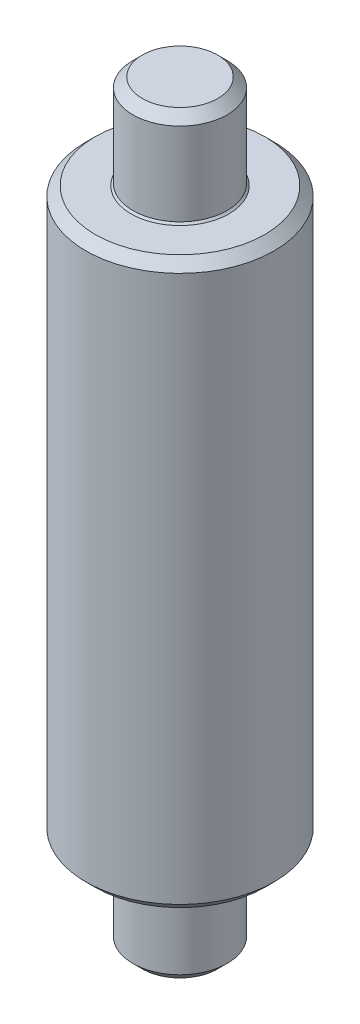
ISO-10303-21;
HEADER;
FILE_DESCRIPTION(('STEP AP214'),'2;1');
FILE_NAME('part.step','',(''),(''),'','','');
FILE_SCHEMA(('AUTOMOTIVE_DESIGN { 1 0 10303 214 1 1 1 1 }'));
ENDSEC;
DATA;
#1=APPLICATION_CONTEXT('core data for automotive mechanical design processes');
#2=APPLICATION_PROTOCOL_DEFINITION('international standard','automotive_design',2000,#1);
#3=PRODUCT_CONTEXT('',#1,'mechanical');
#4=PRODUCT('Part','Part','',(#3));
#5=PRODUCT_RELATED_PRODUCT_CATEGORY('part','',(#4));
#6=PRODUCT_DEFINITION_FORMATION('','',#4);
#7=PRODUCT_DEFINITION_CONTEXT('part definition',#1,'design');
#8=PRODUCT_DEFINITION('design','',#6,#7);
#9=PRODUCT_DEFINITION_SHAPE('','',#8);
#10=(LENGTH_UNIT() NAMED_UNIT(*) SI_UNIT(.MILLI.,.METRE.));
#11=(NAMED_UNIT(*) PLANE_ANGLE_UNIT() SI_UNIT($,.RADIAN.));
#12=(NAMED_UNIT(*) SI_UNIT($,.STERADIAN.) SOLID_ANGLE_UNIT());
#13=UNCERTAINTY_MEASURE_WITH_UNIT(LENGTH_MEASURE(1.E-05),#10,'distance_accuracy_value','');
#14=(GEOMETRIC_REPRESENTATION_CONTEXT(3) GLOBAL_UNCERTAINTY_ASSIGNED_CONTEXT((#13)) GLOBAL_UNIT_ASSIGNED_CONTEXT((#10,
#11,#12)) REPRESENTATION_CONTEXT('',''));
#15=CARTESIAN_POINT('',(0.,0.,0.));
#16=DIRECTION('',(0.,0.,1.));
#17=DIRECTION('',(1.,0.,0.));
#18=AXIS2_PLACEMENT_3D('',#15,#16,#17);
#19=CARTESIAN_POINT('',(0.,40.,0.));
#20=DIRECTION('',(0.,-1.,0.));
#21=DIRECTION('',(1.,0.,0.));
#22=AXIS2_PLACEMENT_3D('',#19,#20,#21);
#23=PLANE('',#22);
#24=CARTESIAN_POINT('',(0.,40.,0.));
#25=DIRECTION('',(0.,-1.,0.));
#26=DIRECTION('',(1.,0.,0.));
#27=AXIS2_PLACEMENT_3D('',#24,#25,#26);
#28=CIRCLE('',#27,3.99999999999999);
#29=CARTESIAN_POINT('',(3.99999999999998,40.,0.));
#30=VERTEX_POINT('',#29);
#31=EDGE_CURVE('E59',#30,#30,#28,.F.);
#32=ORIENTED_EDGE('',*,*,#31,.T.);
#33=EDGE_LOOP('',(#32));
#34=FACE_BOUND('',#33,.T.);
#35=ADVANCED_FACE('F35',(#34),#23,.F.);
#36=CARTESIAN_POINT('',(0.,40.,0.));
#37=DIRECTION('',(0.,1.,0.));
#38=DIRECTION('',(-1.,0.,0.));
#39=AXIS2_PLACEMENT_3D('',#36,#37,#38);
#40=CYLINDRICAL_SURFACE('',#39,5.00000000000001);
#41=CARTESIAN_POINT('',(0.,30.2,0.));
#42=DIRECTION('',(0.,-1.,0.));
#43=DIRECTION('',(1.,0.,0.));
#44=AXIS2_PLACEMENT_3D('',#41,#42,#43);
#45=CIRCLE('',#44,5.00000000000001);
#46=CARTESIAN_POINT('',(5.,30.2,0.));
#47=VERTEX_POINT('',#46);
#48=EDGE_CURVE('E51',#47,#47,#45,.F.);
#49=ORIENTED_EDGE('',*,*,#48,.T.);
#50=EDGE_LOOP('',(#49));
#51=FACE_BOUND('',#50,.T.);
#52=CARTESIAN_POINT('',(0.,39.,0.));
#53=DIRECTION('',(0.,-1.,0.));
#54=DIRECTION('',(1.,0.,0.));
#55=AXIS2_PLACEMENT_3D('',#52,#53,#54);
#56=CIRCLE('',#55,5.00000000000001);
#57=CARTESIAN_POINT('',(5.,39.,0.));
#58=VERTEX_POINT('',#57);
#59=EDGE_CURVE('E56',#58,#58,#56,.T.);
#60=ORIENTED_EDGE('',*,*,#59,.T.);
#61=EDGE_LOOP('',(#60));
#62=FACE_BOUND('',#61,.T.);
#63=ADVANCED_FACE('F93',(#51,#62),#40,.T.);
#64=CARTESIAN_POINT('',(5.00000000000001,30.,0.));
#65=DIRECTION('',(0.,-1.,0.));
#66=DIRECTION('',(1.,0.,0.));
#67=AXIS2_PLACEMENT_3D('',#64,#65,#66);
#68=PLANE('',#67);
#69=CARTESIAN_POINT('',(0.,30.,0.));
#70=DIRECTION('',(0.,-1.,0.));
#71=DIRECTION('',(1.,0.,0.));
#72=AXIS2_PLACEMENT_3D('',#69,#70,#71);
#73=CIRCLE('',#72,5.2);
#74=CARTESIAN_POINT('',(5.19999999999999,30.,0.));
#75=VERTEX_POINT('',#74);
#76=EDGE_CURVE('E47',#75,#75,#73,.T.);
#77=ORIENTED_EDGE('',*,*,#76,.T.);
#78=EDGE_LOOP('',(#77));
#79=FACE_BOUND('',#78,.T.);
#80=CARTESIAN_POINT('',(0.,30.,0.));
#81=DIRECTION('',(0.,-1.,0.));
#82=DIRECTION('',(1.,0.,0.));
#83=AXIS2_PLACEMENT_3D('',#80,#81,#82);
#84=CIRCLE('',#83,9.00000000000003);
#85=CARTESIAN_POINT('',(9.00000000000002,30.,0.));
#86=VERTEX_POINT('',#85);
#87=EDGE_CURVE('E68',#86,#86,#84,.F.);
#88=ORIENTED_EDGE('',*,*,#87,.T.);
#89=EDGE_LOOP('',(#88));
#90=FACE_BOUND('',#89,.T.);
#91=ADVANCED_FACE('F91',(#79,#90),#68,.F.);
#92=CARTESIAN_POINT('',(0.,40.,0.));
#93=DIRECTION('',(0.,1.,0.));
#94=DIRECTION('',(-1.,0.,0.));
#95=AXIS2_PLACEMENT_3D('',#92,#93,#94);
#96=CYLINDRICAL_SURFACE('',#95,10.);
#97=CARTESIAN_POINT('',(0.,-29.,0.));
#98=DIRECTION('',(0.,1.,0.));
#99=DIRECTION('',(-1.,0.,0.));
#100=AXIS2_PLACEMENT_3D('',#97,#98,#99);
#101=CIRCLE('',#100,10.);
#102=CARTESIAN_POINT('',(-10.,-29.,0.));
#103=VERTEX_POINT('',#102);
#104=EDGE_CURVE('E74',#103,#103,#101,.T.);
#105=ORIENTED_EDGE('',*,*,#104,.T.);
#106=EDGE_LOOP('',(#105));
#107=FACE_BOUND('',#106,.T.);
#108=CARTESIAN_POINT('',(0.,29.,0.));
#109=DIRECTION('',(0.,-1.,0.));
#110=DIRECTION('',(1.,0.,0.));
#111=AXIS2_PLACEMENT_3D('',#108,#109,#110);
#112=CIRCLE('',#111,10.);
#113=CARTESIAN_POINT('',(10.,29.,0.));
#114=VERTEX_POINT('',#113);
#115=EDGE_CURVE('E77',#114,#114,#112,.T.);
#116=ORIENTED_EDGE('',*,*,#115,.T.);
#117=EDGE_LOOP('',(#116));
#118=FACE_BOUND('',#117,.T.);
#119=ADVANCED_FACE('F81',(#107,#118),#96,.T.);
#120=CARTESIAN_POINT('',(10.,-30.,0.));
#121=DIRECTION('',(0.,1.,0.));
#122=DIRECTION('',(-1.,0.,0.));
#123=AXIS2_PLACEMENT_3D('',#120,#121,#122);
#124=PLANE('',#123);
#125=CARTESIAN_POINT('',(0.,-30.,0.));
#126=DIRECTION('',(0.,1.,0.));
#127=DIRECTION('',(-1.,0.,0.));
#128=AXIS2_PLACEMENT_3D('',#125,#126,#127);
#129=CIRCLE('',#128,5.20000000000003);
#130=CARTESIAN_POINT('',(-5.20000000000003,-30.,0.));
#131=VERTEX_POINT('',#130);
#132=EDGE_CURVE('E43',#131,#131,#129,.T.);
#133=ORIENTED_EDGE('',*,*,#132,.T.);
#134=EDGE_LOOP('',(#133));
#135=FACE_BOUND('',#134,.T.);
#136=CARTESIAN_POINT('',(0.,-30.,0.));
#137=DIRECTION('',(0.,1.,0.));
#138=DIRECTION('',(-1.,0.,0.));
#139=AXIS2_PLACEMENT_3D('',#136,#137,#138);
#140=CIRCLE('',#139,9.00000000000003);
#141=CARTESIAN_POINT('',(-9.00000000000002,-30.,0.));
#142=VERTEX_POINT('',#141);
#143=EDGE_CURVE('E71',#142,#142,#140,.F.);
#144=ORIENTED_EDGE('',*,*,#143,.T.);
#145=EDGE_LOOP('',(#144));
#146=FACE_BOUND('',#145,.T.);
#147=ADVANCED_FACE('F100',(#135,#146),#124,.F.);
#148=CARTESIAN_POINT('',(0.,40.,0.));
#149=DIRECTION('',(0.,1.,0.));
#150=DIRECTION('',(-1.,0.,0.));
#151=AXIS2_PLACEMENT_3D('',#148,#149,#150);
#152=CYLINDRICAL_SURFACE('',#151,5.);
#153=CARTESIAN_POINT('',(0.,-30.2,0.));
#154=DIRECTION('',(0.,1.,0.));
#155=DIRECTION('',(-1.,0.,0.));
#156=AXIS2_PLACEMENT_3D('',#153,#154,#155);
#157=CIRCLE('',#156,5.);
#158=CARTESIAN_POINT('',(-5.,-30.2,0.));
#159=VERTEX_POINT('',#158);
#160=EDGE_CURVE('E10',#159,#159,#157,.F.);
#161=ORIENTED_EDGE('',*,*,#160,.T.);
#162=EDGE_LOOP('',(#161));
#163=FACE_BOUND('',#162,.T.);
#164=CARTESIAN_POINT('',(0.,-39.,0.));
#165=DIRECTION('',(0.,1.,0.));
#166=DIRECTION('',(-1.,0.,0.));
#167=AXIS2_PLACEMENT_3D('',#164,#165,#166);
#168=CIRCLE('',#167,5.);
#169=CARTESIAN_POINT('',(-5.,-39.,0.));
#170=VERTEX_POINT('',#169);
#171=EDGE_CURVE('E65',#170,#170,#168,.T.);
#172=ORIENTED_EDGE('',*,*,#171,.T.);
#173=EDGE_LOOP('',(#172));
#174=FACE_BOUND('',#173,.T.);
#175=ADVANCED_FACE('F163',(#163,#174),#152,.T.);
#176=CARTESIAN_POINT('',(5.00000000000001,-40.,0.));
#177=DIRECTION('',(0.,1.,0.));
#178=DIRECTION('',(-1.,0.,0.));
#179=AXIS2_PLACEMENT_3D('',#176,#177,#178);
#180=PLANE('',#179);
#181=CARTESIAN_POINT('',(0.,-40.,0.));
#182=DIRECTION('',(0.,1.,0.));
#183=DIRECTION('',(-1.,0.,0.));
#184=AXIS2_PLACEMENT_3D('',#181,#182,#183);
#185=CIRCLE('',#184,4.00000000000002);
#186=CARTESIAN_POINT('',(-4.00000000000002,-40.,0.));
#187=VERTEX_POINT('',#186);
#188=EDGE_CURVE('E62',#187,#187,#185,.F.);
#189=ORIENTED_EDGE('',*,*,#188,.T.);
#190=EDGE_LOOP('',(#189));
#191=FACE_BOUND('',#190,.T.);
#192=ADVANCED_FACE('F116',(#191),#180,.F.);
#193=CARTESIAN_POINT('',(0.,-29.,0.));
#194=DIRECTION('',(0.,1.,0.));
#195=DIRECTION('',(-1.,0.,0.));
#196=AXIS2_PLACEMENT_3D('',#193,#194,#195);
#197=CONICAL_SURFACE('',#196,10.,0.785398163397446);
#198=ORIENTED_EDGE('',*,*,#143,.F.);
#199=EDGE_LOOP('',(#198));
#200=FACE_BOUND('',#199,.T.);
#201=ORIENTED_EDGE('',*,*,#104,.F.);
#202=EDGE_LOOP('',(#201));
#203=FACE_BOUND('',#202,.T.);
#204=ADVANCED_FACE('F87',(#200,#203),#197,.T.);
#205=CARTESIAN_POINT('',(0.,30.,0.));
#206=DIRECTION('',(0.,-1.,0.));
#207=DIRECTION('',(1.,0.,0.));
#208=AXIS2_PLACEMENT_3D('',#205,#206,#207);
#209=CONICAL_SURFACE('',#208,9.00000000000002,0.785398163397448);
#210=ORIENTED_EDGE('',*,*,#115,.F.);
#211=EDGE_LOOP('',(#210));
#212=FACE_BOUND('',#211,.T.);
#213=ORIENTED_EDGE('',*,*,#87,.F.);
#214=EDGE_LOOP('',(#213));
#215=FACE_BOUND('',#214,.T.);
#216=ADVANCED_FACE('F83',(#212,#215),#209,.T.);
#217=CARTESIAN_POINT('',(0.,-39.,0.));
#218=DIRECTION('',(0.,1.,0.));
#219=DIRECTION('',(-1.,0.,0.));
#220=AXIS2_PLACEMENT_3D('',#217,#218,#219);
#221=CONICAL_SURFACE('',#220,5.,0.785398163397459);
#222=ORIENTED_EDGE('',*,*,#188,.F.);
#223=EDGE_LOOP('',(#222));
#224=FACE_BOUND('',#223,.T.);
#225=ORIENTED_EDGE('',*,*,#171,.F.);
#226=EDGE_LOOP('',(#225));
#227=FACE_BOUND('',#226,.T.);
#228=ADVANCED_FACE('F86',(#224,#227),#221,.T.);
#229=CARTESIAN_POINT('',(0.,40.,0.));
#230=DIRECTION('',(0.,-1.,0.));
#231=DIRECTION('',(1.,0.,0.));
#232=AXIS2_PLACEMENT_3D('',#229,#230,#231);
#233=CONICAL_SURFACE('',#232,3.99999999999999,0.785398163397448);
#234=ORIENTED_EDGE('',*,*,#59,.F.);
#235=EDGE_LOOP('',(#234));
#236=FACE_BOUND('',#235,.T.);
#237=ORIENTED_EDGE('',*,*,#31,.F.);
#238=EDGE_LOOP('',(#237));
#239=FACE_BOUND('',#238,.T.);
#240=ADVANCED_FACE('F127',(#236,#239),#233,.T.);
#241=CARTESIAN_POINT('',(0.,30.2,0.));
#242=DIRECTION('',(0.,-1.,0.));
#243=DIRECTION('',(1.,0.,0.));
#244=AXIS2_PLACEMENT_3D('',#241,#242,#243);
#245=CONICAL_SURFACE('',#244,5.00000000000001,0.785398163397457);
#246=ORIENTED_EDGE('',*,*,#76,.F.);
#247=EDGE_LOOP('',(#246));
#248=FACE_BOUND('',#247,.T.);
#249=ORIENTED_EDGE('',*,*,#48,.F.);
#250=EDGE_LOOP('',(#249));
#251=FACE_BOUND('',#250,.T.);
#252=ADVANCED_FACE('F133',(#248,#251),#245,.T.);
#253=CARTESIAN_POINT('',(0.,-30.,0.));
#254=DIRECTION('',(0.,1.,0.));
#255=DIRECTION('',(-1.,0.,0.));
#256=AXIS2_PLACEMENT_3D('',#253,#254,#255);
#257=CONICAL_SURFACE('',#256,5.20000000000003,0.785398163397461);
#258=ORIENTED_EDGE('',*,*,#160,.F.);
#259=EDGE_LOOP('',(#258));
#260=FACE_BOUND('',#259,.T.);
#261=ORIENTED_EDGE('',*,*,#132,.F.);
#262=EDGE_LOOP('',(#261));
#263=FACE_BOUND('',#262,.T.);
#264=ADVANCED_FACE('F38',(#260,#263),#257,.T.);
#265=CLOSED_SHELL('',(#35,#63,#91,#119,#147,#175,#192,#204,#216,#228,#240,#252,#264));
#266=MANIFOLD_SOLID_BREP('B2',#265);
#267=ADVANCED_BREP_SHAPE_REPRESENTATION('',(#18,#266),#14);
#268=SHAPE_DEFINITION_REPRESENTATION(#9,#267);
ENDSEC;
END-ISO-10303-21;
